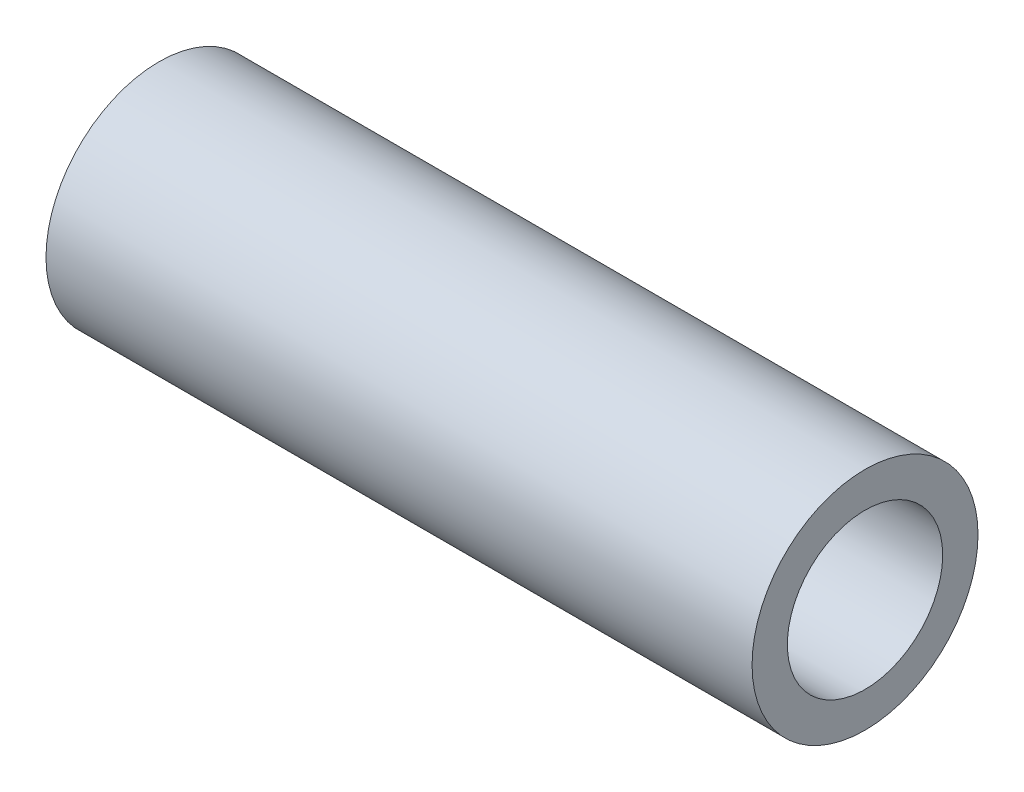
ISO-10303-21;
HEADER;
FILE_DESCRIPTION(('STEP AP214'),'2;1');
FILE_NAME('part.step','',(''),(''),'','','');
FILE_SCHEMA(('AUTOMOTIVE_DESIGN { 1 0 10303 214 1 1 1 1 }'));
ENDSEC;
DATA;
#1=APPLICATION_CONTEXT('core data for automotive mechanical design processes');
#2=APPLICATION_PROTOCOL_DEFINITION('international standard','automotive_design',2000,#1);
#3=PRODUCT_CONTEXT('',#1,'mechanical');
#4=PRODUCT('Part','Part','',(#3));
#5=PRODUCT_RELATED_PRODUCT_CATEGORY('part','',(#4));
#6=PRODUCT_DEFINITION_FORMATION('','',#4);
#7=PRODUCT_DEFINITION_CONTEXT('part definition',#1,'design');
#8=PRODUCT_DEFINITION('design','',#6,#7);
#9=PRODUCT_DEFINITION_SHAPE('','',#8);
#10=(LENGTH_UNIT() NAMED_UNIT(*) SI_UNIT(.MILLI.,.METRE.));
#11=(NAMED_UNIT(*) PLANE_ANGLE_UNIT() SI_UNIT($,.RADIAN.));
#12=(NAMED_UNIT(*) SI_UNIT($,.STERADIAN.) SOLID_ANGLE_UNIT());
#13=UNCERTAINTY_MEASURE_WITH_UNIT(LENGTH_MEASURE(1.E-05),#10,'distance_accuracy_value','');
#14=(GEOMETRIC_REPRESENTATION_CONTEXT(3) GLOBAL_UNCERTAINTY_ASSIGNED_CONTEXT((#13)) GLOBAL_UNIT_ASSIGNED_CONTEXT((#10,
#11,#12)) REPRESENTATION_CONTEXT('',''));
#15=CARTESIAN_POINT('',(0.,0.,0.));
#16=DIRECTION('',(0.,0.,1.));
#17=DIRECTION('',(1.,0.,0.));
#18=AXIS2_PLACEMENT_3D('',#15,#16,#17);
#19=CARTESIAN_POINT('',(12.5,0.,0.));
#20=DIRECTION('',(1.,0.,0.));
#21=DIRECTION('',(0.,0.,-1.));
#22=AXIS2_PLACEMENT_3D('',#19,#20,#21);
#23=PLANE('',#22);
#24=CARTESIAN_POINT('',(12.5,0.,0.));
#25=DIRECTION('',(1.,0.,0.));
#26=DIRECTION('',(0.,0.,-1.));
#27=AXIS2_PLACEMENT_3D('',#24,#25,#26);
#28=CIRCLE('',#27,4.);
#29=CARTESIAN_POINT('',(12.5,0.,-4.));
#30=VERTEX_POINT('',#29);
#31=EDGE_CURVE('E10',#30,#30,#28,.T.);
#32=ORIENTED_EDGE('',*,*,#31,.T.);
#33=EDGE_LOOP('',(#32));
#34=FACE_BOUND('',#33,.T.);
#35=CARTESIAN_POINT('',(12.5,0.,0.));
#36=DIRECTION('',(1.,0.,0.));
#37=DIRECTION('',(0.,0.,-1.));
#38=AXIS2_PLACEMENT_3D('',#35,#36,#37);
#39=CIRCLE('',#38,2.75);
#40=CARTESIAN_POINT('',(12.5,0.,-2.75));
#41=VERTEX_POINT('',#40);
#42=EDGE_CURVE('E42',#41,#41,#39,.T.);
#43=ORIENTED_EDGE('',*,*,#42,.F.);
#44=EDGE_LOOP('',(#43));
#45=FACE_BOUND('',#44,.T.);
#46=ADVANCED_FACE('F31',(#34,#45),#23,.T.);
#47=CARTESIAN_POINT('',(-12.5,0.,0.));
#48=DIRECTION('',(1.,0.,0.));
#49=DIRECTION('',(0.,0.,-1.));
#50=AXIS2_PLACEMENT_3D('',#47,#48,#49);
#51=PLANE('',#50);
#52=CARTESIAN_POINT('',(-12.5,0.,0.));
#53=DIRECTION('',(1.,0.,0.));
#54=DIRECTION('',(0.,0.,-1.));
#55=AXIS2_PLACEMENT_3D('',#52,#53,#54);
#56=CIRCLE('',#55,4.);
#57=CARTESIAN_POINT('',(-12.5,0.,-4.));
#58=VERTEX_POINT('',#57);
#59=EDGE_CURVE('E35',#58,#58,#56,.T.);
#60=ORIENTED_EDGE('',*,*,#59,.F.);
#61=EDGE_LOOP('',(#60));
#62=FACE_BOUND('',#61,.T.);
#63=CARTESIAN_POINT('',(-12.5,0.,0.));
#64=DIRECTION('',(1.,0.,0.));
#65=DIRECTION('',(0.,0.,-1.));
#66=AXIS2_PLACEMENT_3D('',#63,#64,#65);
#67=CIRCLE('',#66,2.75);
#68=CARTESIAN_POINT('',(-12.5,0.,-2.75));
#69=VERTEX_POINT('',#68);
#70=EDGE_CURVE('E44',#69,#69,#67,.T.);
#71=ORIENTED_EDGE('',*,*,#70,.T.);
#72=EDGE_LOOP('',(#71));
#73=FACE_BOUND('',#72,.T.);
#74=ADVANCED_FACE('F54',(#62,#73),#51,.F.);
#75=CARTESIAN_POINT('',(12.5,0.,0.));
#76=DIRECTION('',(-1.,0.,0.));
#77=DIRECTION('',(0.,0.,1.));
#78=AXIS2_PLACEMENT_3D('',#75,#76,#77);
#79=CYLINDRICAL_SURFACE('',#78,4.);
#80=ORIENTED_EDGE('',*,*,#31,.F.);
#81=EDGE_LOOP('',(#80));
#82=FACE_BOUND('',#81,.T.);
#83=ORIENTED_EDGE('',*,*,#59,.T.);
#84=EDGE_LOOP('',(#83));
#85=FACE_BOUND('',#84,.T.);
#86=ADVANCED_FACE('F33',(#82,#85),#79,.T.);
#87=CARTESIAN_POINT('',(12.5,0.,0.));
#88=DIRECTION('',(-1.,0.,0.));
#89=DIRECTION('',(0.,0.,1.));
#90=AXIS2_PLACEMENT_3D('',#87,#88,#89);
#91=CYLINDRICAL_SURFACE('',#90,2.75);
#92=ORIENTED_EDGE('',*,*,#42,.T.);
#93=EDGE_LOOP('',(#92));
#94=FACE_BOUND('',#93,.T.);
#95=ORIENTED_EDGE('',*,*,#70,.F.);
#96=EDGE_LOOP('',(#95));
#97=FACE_BOUND('',#96,.T.);
#98=ADVANCED_FACE('F50',(#94,#97),#91,.F.);
#99=CLOSED_SHELL('',(#46,#74,#86,#98));
#100=MANIFOLD_SOLID_BREP('B2',#99);
#101=ADVANCED_BREP_SHAPE_REPRESENTATION('',(#18,#100),#14);
#102=SHAPE_DEFINITION_REPRESENTATION(#9,#101);
ENDSEC;
END-ISO-10303-21;
